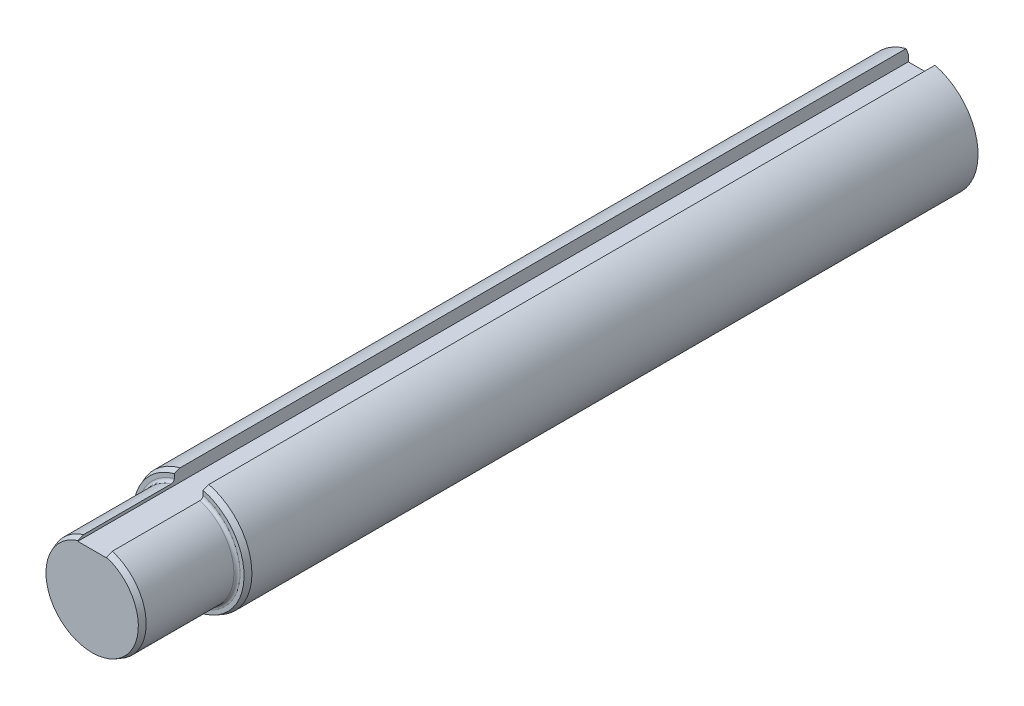
ISO-10303-21;
HEADER;
FILE_DESCRIPTION(('STEP AP214'),'2;1');
FILE_NAME('part.step','',(''),(''),'','','');
FILE_SCHEMA(('AUTOMOTIVE_DESIGN { 1 0 10303 214 1 1 1 1 }'));
ENDSEC;
DATA;
#1=APPLICATION_CONTEXT('core data for automotive mechanical design processes');
#2=APPLICATION_PROTOCOL_DEFINITION('international standard','automotive_design',2000,#1);
#3=PRODUCT_CONTEXT('',#1,'mechanical');
#4=PRODUCT('Part','Part','',(#3));
#5=PRODUCT_RELATED_PRODUCT_CATEGORY('part','',(#4));
#6=PRODUCT_DEFINITION_FORMATION('','',#4);
#7=PRODUCT_DEFINITION_CONTEXT('part definition',#1,'design');
#8=PRODUCT_DEFINITION('design','',#6,#7);
#9=PRODUCT_DEFINITION_SHAPE('','',#8);
#10=(LENGTH_UNIT() NAMED_UNIT(*) SI_UNIT(.MILLI.,.METRE.));
#11=(NAMED_UNIT(*) PLANE_ANGLE_UNIT() SI_UNIT($,.RADIAN.));
#12=(NAMED_UNIT(*) SI_UNIT($,.STERADIAN.) SOLID_ANGLE_UNIT());
#13=UNCERTAINTY_MEASURE_WITH_UNIT(LENGTH_MEASURE(1.E-05),#10,'distance_accuracy_value','');
#14=(GEOMETRIC_REPRESENTATION_CONTEXT(3) GLOBAL_UNCERTAINTY_ASSIGNED_CONTEXT((#13)) GLOBAL_UNIT_ASSIGNED_CONTEXT((#10,
#11,#12)) REPRESENTATION_CONTEXT('',''));
#15=CARTESIAN_POINT('',(0.,0.,0.));
#16=DIRECTION('',(0.,0.,1.));
#17=DIRECTION('',(1.,0.,0.));
#18=AXIS2_PLACEMENT_3D('',#15,#16,#17);
#19=CARTESIAN_POINT('',(-1.1938,0.,-41.075600094));
#20=DIRECTION('',(-1.,0.,0.));
#21=DIRECTION('',(0.,-1.,0.));
#22=AXIS2_PLACEMENT_3D('',#19,#20,#21);
#23=PLANE('',#22);
#24=DIRECTION('',(0.,0.,1.));
#25=VECTOR('',#24,1.);
#26=CARTESIAN_POINT('',(-1.1938,4.61044984898437,-41.075600094));
#27=LINE('',#26,#25);
#28=CARTESIAN_POINT('',(-1.1938,4.61044984898437,-40.9022592699307));
#29=VERTEX_POINT('',#28);
#30=CARTESIAN_POINT('',(-1.1938,4.61044984898437,19.273750126));
#31=VERTEX_POINT('',#30);
#32=EDGE_CURVE('E166',#29,#31,#27,.T.);
#33=ORIENTED_EDGE('',*,*,#32,.T.);
#34=CARTESIAN_POINT('',(-1.1938,4.61044984898437,19.273750126));
#35=CARTESIAN_POINT('',(-1.1938,4.58060288584432,19.353137865186));
#36=CARTESIAN_POINT('',(-1.1938,4.55073900250677,19.4325192347456));
#37=CARTESIAN_POINT('',(-1.1938,4.49097739538637,19.5912692347456));
#38=CARTESIAN_POINT('',(-1.1938,4.46107967160346,19.670637865186));
#39=CARTESIAN_POINT('',(-1.1938,4.431165027623,19.750000126));
#40=B_SPLINE_CURVE_WITH_KNOTS('',3,(#34,#35,#36,#37,#38,#39),.UNSPECIFIED.,.F.,.F.,(4,2,4),(0.,
0.254439148423304,0.508878297275227),.UNSPECIFIED.);
#41=CARTESIAN_POINT('',(-1.1938,4.431165027623,19.750000126));
#42=VERTEX_POINT('',#41);
#43=EDGE_CURVE('E231',#31,#42,#40,.T.);
#44=ORIENTED_EDGE('',*,*,#43,.T.);
#45=DIRECTION('',(0.,1.,0.));
#46=VECTOR('',#45,1.);
#47=CARTESIAN_POINT('',(-1.1938,0.,19.750000126));
#48=LINE('',#47,#46);
#49=CARTESIAN_POINT('',(-1.1938,4.08305737897473,19.750000126));
#50=VERTEX_POINT('',#49);
#51=EDGE_CURVE('E279',#50,#42,#48,.T.);
#52=ORIENTED_EDGE('',*,*,#51,.F.);
#53=CARTESIAN_POINT('',(-1.1938,4.08305737897473,19.750000126));
#54=CARTESIAN_POINT('',(-1.1938,4.06765056022969,19.7499904472236));
#55=CARTESIAN_POINT('',(-1.1938,4.05224482986097,19.7512910544198));
#56=CARTESIAN_POINT('',(-1.1938,4.02185844419262,19.7564376602052));
#57=CARTESIAN_POINT('',(-1.1938,4.00687795240916,19.7602846244751));
#58=CARTESIAN_POINT('',(-1.1938,3.97776585933373,19.7704526468026));
#59=CARTESIAN_POINT('',(-1.1938,3.96363493390597,19.7767756453712));
#60=CARTESIAN_POINT('',(-1.1938,3.93666662762973,19.7917434514951));
#61=CARTESIAN_POINT('',(-1.1938,3.92382864393618,19.8003871700386));
#62=CARTESIAN_POINT('',(-1.1938,3.90007388309732,19.8196084342872));
#63=CARTESIAN_POINT('',(-1.1938,3.88912652462854,19.8301481253765));
#64=CARTESIAN_POINT('',(-1.1938,3.86924776269803,19.8529902805941));
#65=CARTESIAN_POINT('',(-1.1938,3.86031647747126,19.8652928480391));
#66=CARTESIAN_POINT('',(-1.1938,3.84513068592101,19.8907603031013));
#67=CARTESIAN_POINT('',(-1.1938,3.83878042949035,19.9038681718629));
#68=CARTESIAN_POINT('',(-1.1938,3.82848528325712,19.9309891218481));
#69=CARTESIAN_POINT('',(-1.1938,3.82453733268837,19.9450010259489));
#70=CARTESIAN_POINT('',(-1.1938,3.82048086098944,19.9666201718907));
#71=CARTESIAN_POINT('',(-1.1938,3.81943895920923,19.9740632468456));
#72=CARTESIAN_POINT('',(-1.1938,3.8180494369443,19.9890029535984));
#73=CARTESIAN_POINT('',(-1.1938,3.81770080649552,19.9964994914973));
#74=CARTESIAN_POINT('',(-1.1938,3.81770108311266,20.004000126));
#75=B_SPLINE_CURVE_WITH_KNOTS('',3,(#53,#54,#55,#56,#57,#58,#59,#60,#61,#62,#63,#64,#65,#66,#67,
#68,#69,#70,#71,#72,#73,#74),.UNSPECIFIED.,.F.,.F.,(4,2,2,2,2,2,2,2,2,2,4),(0.,
0.0461648311069006,0.0923471798070931,0.138565795087578,0.184762759796601,0.230123136388613,
0.275486172501751,0.318965571666884,0.362389457311054,0.38490804800109,0.407393809297497),.UNSPECIFIED.);
#76=CARTESIAN_POINT('',(-1.1938,3.81770108311271,20.004000126));
#77=VERTEX_POINT('',#76);
#78=EDGE_CURVE('E11',#50,#77,#75,.T.);
#79=ORIENTED_EDGE('',*,*,#78,.T.);
#80=DIRECTION('',(0.,0.,1.));
#81=VECTOR('',#80,1.);
#82=CARTESIAN_POINT('',(-1.1938,3.81770108311271,19.750000126));
#83=LINE('',#82,#81);
#84=CARTESIAN_POINT('',(-1.1938,3.81770108311271,27.273750126));
#85=VERTEX_POINT('',#84);
#86=EDGE_CURVE('E275',#85,#77,#83,.F.);
#87=ORIENTED_EDGE('',*,*,#86,.F.);
#88=CARTESIAN_POINT('',(-1.1938,3.81770108311272,27.273750126));
#89=CARTESIAN_POINT('',(-1.1938,3.78742426532031,27.3531481306492));
#90=CARTESIAN_POINT('',(-1.1938,3.75711735204131,27.4325346328475));
#91=CARTESIAN_POINT('',(-1.1938,3.69644333431697,27.5912846328477));
#92=CARTESIAN_POINT('',(-1.1938,3.66607622987124,27.6706481306494));
#93=CARTESIAN_POINT('',(-1.1938,3.63567902993854,27.750000126));
#94=B_SPLINE_CURVE_WITH_KNOTS('',3,(#88,#89,#90,#91,#92,#93),.UNSPECIFIED.,.F.,.F.,(4,2,4),(0.,
0.254924560437012,0.509849122497376),.UNSPECIFIED.);
#95=CARTESIAN_POINT('',(-1.1938,3.63567902993854,27.750000126));
#96=VERTEX_POINT('',#95);
#97=EDGE_CURVE('E214',#85,#96,#94,.T.);
#98=ORIENTED_EDGE('',*,*,#97,.T.);
#99=DIRECTION('',(0.,-1.,0.));
#100=VECTOR('',#99,1.);
#101=CARTESIAN_POINT('',(-1.1938,0.,27.750000126));
#102=LINE('',#101,#100);
#103=CARTESIAN_POINT('',(-1.1938,3.571875,27.750000126));
#104=VERTEX_POINT('',#103);
#105=EDGE_CURVE('E137',#96,#104,#102,.T.);
#106=ORIENTED_EDGE('',*,*,#105,.T.);
#107=DIRECTION('',(0.,0.,1.));
#108=VECTOR('',#107,1.);
#109=CARTESIAN_POINT('',(-1.1938,3.571875,-41.075600094));
#110=LINE('',#109,#108);
#111=CARTESIAN_POINT('',(-1.1938,3.571875,-41.075600094));
#112=VERTEX_POINT('',#111);
#113=EDGE_CURVE('E148',#112,#104,#110,.T.);
#114=ORIENTED_EDGE('',*,*,#113,.F.);
#115=DIRECTION('',(0.,-1.,0.));
#116=VECTOR('',#115,1.);
#117=CARTESIAN_POINT('',(-1.1938,0.,-41.075600094));
#118=LINE('',#117,#116);
#119=CARTESIAN_POINT('',(-1.1938,4.11664676921643,-41.075600094));
#120=VERTEX_POINT('',#119);
#121=EDGE_CURVE('E155',#120,#112,#118,.T.);
#122=ORIENTED_EDGE('',*,*,#121,.F.);
#123=CARTESIAN_POINT('',(-1.1938,4.11664676921643,-41.075600094));
#124=CARTESIAN_POINT('',(-1.1938,4.19898295992843,-41.0468115870855));
#125=CARTESIAN_POINT('',(-1.1938,4.28130131275715,-41.0179722646649));
#126=CARTESIAN_POINT('',(-1.1938,4.44590233934503,-40.960191989971));
#127=CARTESIAN_POINT('',(-1.1938,4.52818501310562,-40.9312510377019));
#128=CARTESIAN_POINT('',(-1.1938,4.61044984898437,-40.9022592699307));
#129=B_SPLINE_CURVE_WITH_KNOTS('',3,(#123,#124,#125,#126,#127,#128),.UNSPECIFIED.,.F.,.F.,(4,2,
4),(0.,0.26167185475518,0.523343699008511),.UNSPECIFIED.);
#130=EDGE_CURVE('E206',#120,#29,#129,.T.);
#131=ORIENTED_EDGE('',*,*,#130,.T.);
#132=EDGE_LOOP('',(#33,#44,#52,#79,#87,#98,#106,#114,#122,#131));
#133=FACE_BOUND('',#132,.T.);
#134=ADVANCED_FACE('F45',(#133),#23,.F.);
#135=CARTESIAN_POINT('',(1.1938,0.,-41.075600094));
#136=DIRECTION('',(-1.,0.,0.));
#137=DIRECTION('',(0.,0.,1.));
#138=AXIS2_PLACEMENT_3D('',#135,#136,#137);
#139=PLANE('',#138);
#140=DIRECTION('',(0.,0.,1.));
#141=VECTOR('',#140,1.);
#142=CARTESIAN_POINT('',(1.1938,3.81770108311272,19.750000126));
#143=LINE('',#142,#141);
#144=CARTESIAN_POINT('',(1.1938,3.81770108311272,27.273750126));
#145=VERTEX_POINT('',#144);
#146=CARTESIAN_POINT('',(1.1938,3.81770108311272,20.004000126));
#147=VERTEX_POINT('',#146);
#148=EDGE_CURVE('E266',#145,#147,#143,.F.);
#149=ORIENTED_EDGE('',*,*,#148,.T.);
#150=CARTESIAN_POINT('',(1.1938,3.81770108311272,20.004000126));
#151=CARTESIAN_POINT('',(1.1938,3.81768614673787,19.9901709246719));
#152=CARTESIAN_POINT('',(1.1938,3.81888343314373,19.9763494004261));
#153=CARTESIAN_POINT('',(1.1938,3.82358724466687,19.9491336891685));
#154=CARTESIAN_POINT('',(1.1938,3.82708892477228,19.9357386672448));
#155=CARTESIAN_POINT('',(1.1938,3.83628722263969,19.9097266693181));
#156=CARTESIAN_POINT('',(1.1938,3.84198385722178,19.8971096992783));
#157=CARTESIAN_POINT('',(1.1938,3.85537294919485,19.8729835763823));
#158=CARTESIAN_POINT('',(1.1938,3.86306580829021,19.8614746471392));
#159=CARTESIAN_POINT('',(1.1938,3.88037618025025,19.839629991734));
#160=CARTESIAN_POINT('',(1.1938,3.89002927057952,19.8293224965911));
#161=CARTESIAN_POINT('',(1.1938,3.910866274661,19.8103920026525));
#162=CARTESIAN_POINT('',(1.1938,3.92205059035458,19.8017694475952));
#163=CARTESIAN_POINT('',(1.1938,3.94614274225053,19.7860641836489));
#164=CARTESIAN_POINT('',(1.1938,3.95910391776041,19.7790633554804));
#165=CARTESIAN_POINT('',(1.1938,3.98598644095824,19.7672467667704));
#166=CARTESIAN_POINT('',(1.1938,3.99990775093857,19.7624309204738));
#167=CARTESIAN_POINT('',(1.1938,4.02537190226405,19.7558497214918));
#168=CARTESIAN_POINT('',(1.1938,4.03680679490155,19.7536581028517));
#169=CARTESIAN_POINT('',(1.1938,4.05984593294481,19.7507331653191));
#170=CARTESIAN_POINT('',(1.1938,4.07144992968532,19.7499978875281));
#171=CARTESIAN_POINT('',(1.1938,4.08305737897473,19.750000126));
#172=B_SPLINE_CURVE_WITH_KNOTS('',3,(#150,#151,#152,#153,#154,#155,#156,#157,#158,#159,#160,
#161,#162,#163,#164,#165,#166,#167,#168,#169,#170,#171),.UNSPECIFIED.,.F.,.F.,(4,2,2,2,2,2,2,2,
2,2,4),(0.,0.0414241119424207,0.0827614063279176,0.124099017490222,0.165444953565082,
0.207621940800539,0.249810020652985,0.293807086001235,0.337802424424029,0.372641853649469,
0.407434389063359),.UNSPECIFIED.);
#173=CARTESIAN_POINT('',(1.1938,4.08305737897473,19.750000126));
#174=VERTEX_POINT('',#173);
#175=EDGE_CURVE('E60',#147,#174,#172,.T.);
#176=ORIENTED_EDGE('',*,*,#175,.T.);
#177=DIRECTION('',(0.,1.,0.));
#178=VECTOR('',#177,1.);
#179=CARTESIAN_POINT('',(1.1938,0.,19.750000126));
#180=LINE('',#179,#178);
#181=CARTESIAN_POINT('',(1.1938,4.431165027623,19.750000126));
#182=VERTEX_POINT('',#181);
#183=EDGE_CURVE('E281',#174,#182,#180,.T.);
#184=ORIENTED_EDGE('',*,*,#183,.T.);
#185=CARTESIAN_POINT('',(1.1938,4.431165027623,19.750000126));
#186=CARTESIAN_POINT('',(1.1938,4.46107967160346,19.670637865186));
#187=CARTESIAN_POINT('',(1.1938,4.49097739538637,19.5912692347456));
#188=CARTESIAN_POINT('',(1.1938,4.55073900250677,19.4325192347456));
#189=CARTESIAN_POINT('',(1.1938,4.58060288584432,19.353137865186));
#190=CARTESIAN_POINT('',(1.1938,4.61044984898437,19.273750126));
#191=B_SPLINE_CURVE_WITH_KNOTS('',3,(#185,#186,#187,#188,#189,#190),.UNSPECIFIED.,.F.,.F.,(4,2,
4),(0.,0.254439148851926,0.508878297275234),.UNSPECIFIED.);
#192=CARTESIAN_POINT('',(1.1938,4.61044984898437,19.273750126));
#193=VERTEX_POINT('',#192);
#194=EDGE_CURVE('E263',#182,#193,#191,.T.);
#195=ORIENTED_EDGE('',*,*,#194,.T.);
#196=DIRECTION('',(0.,0.,1.));
#197=VECTOR('',#196,1.);
#198=CARTESIAN_POINT('',(1.1938,4.61044984898437,-41.075600094));
#199=LINE('',#198,#197);
#200=CARTESIAN_POINT('',(1.1938,4.61044984898437,-40.9022592699307));
#201=VERTEX_POINT('',#200);
#202=EDGE_CURVE('E149',#201,#193,#199,.T.);
#203=ORIENTED_EDGE('',*,*,#202,.F.);
#204=CARTESIAN_POINT('',(1.1938,4.61044984898437,-40.9022592699307));
#205=CARTESIAN_POINT('',(1.1938,4.52818501310562,-40.9312510377019));
#206=CARTESIAN_POINT('',(1.1938,4.44590233934503,-40.960191989971));
#207=CARTESIAN_POINT('',(1.1938,4.28130131275715,-41.0179722646649));
#208=CARTESIAN_POINT('',(1.1938,4.19898295992843,-41.0468115870855));
#209=CARTESIAN_POINT('',(1.1938,4.11664676921643,-41.075600094));
#210=B_SPLINE_CURVE_WITH_KNOTS('',3,(#204,#205,#206,#207,#208,#209),.UNSPECIFIED.,.F.,.F.,(4,2,
4),(0.,0.261671844253333,0.523343699008512),.UNSPECIFIED.);
#211=CARTESIAN_POINT('',(1.1938,4.11664676921643,-41.075600094));
#212=VERTEX_POINT('',#211);
#213=EDGE_CURVE('E179',#201,#212,#210,.T.);
#214=ORIENTED_EDGE('',*,*,#213,.T.);
#215=DIRECTION('',(0.,-1.,0.));
#216=VECTOR('',#215,1.);
#217=CARTESIAN_POINT('',(1.1938,0.,-41.075600094));
#218=LINE('',#217,#216);
#219=CARTESIAN_POINT('',(1.1938,3.571875,-41.075600094));
#220=VERTEX_POINT('',#219);
#221=EDGE_CURVE('E143',#212,#220,#218,.T.);
#222=ORIENTED_EDGE('',*,*,#221,.T.);
#223=DIRECTION('',(0.,0.,1.));
#224=VECTOR('',#223,1.);
#225=CARTESIAN_POINT('',(1.1938,3.571875,-41.075600094));
#226=LINE('',#225,#224);
#227=CARTESIAN_POINT('',(1.1938,3.571875,27.750000126));
#228=VERTEX_POINT('',#227);
#229=EDGE_CURVE('E140',#220,#228,#226,.T.);
#230=ORIENTED_EDGE('',*,*,#229,.T.);
#231=DIRECTION('',(0.,-1.,0.));
#232=VECTOR('',#231,1.);
#233=CARTESIAN_POINT('',(1.1938,0.,27.750000126));
#234=LINE('',#233,#232);
#235=CARTESIAN_POINT('',(1.1938,3.63567902993854,27.750000126));
#236=VERTEX_POINT('',#235);
#237=EDGE_CURVE('E128',#236,#228,#234,.T.);
#238=ORIENTED_EDGE('',*,*,#237,.F.);
#239=CARTESIAN_POINT('',(1.1938,3.63567902993854,27.750000126));
#240=CARTESIAN_POINT('',(1.1938,3.66607622987124,27.6706481306494));
#241=CARTESIAN_POINT('',(1.1938,3.69644333431697,27.5912846328477));
#242=CARTESIAN_POINT('',(1.1938,3.75711735204131,27.4325346328475));
#243=CARTESIAN_POINT('',(1.1938,3.78742426532031,27.3531481306492));
#244=CARTESIAN_POINT('',(1.1938,3.81770108311271,27.273750126));
#245=B_SPLINE_CURVE_WITH_KNOTS('',3,(#239,#240,#241,#242,#243,#244),.UNSPECIFIED.,.F.,.F.,(4,2,
4),(0.,0.254924562060364,0.509849122497375),.UNSPECIFIED.);
#246=EDGE_CURVE('E187',#236,#145,#245,.T.);
#247=ORIENTED_EDGE('',*,*,#246,.T.);
#248=EDGE_LOOP('',(#149,#176,#184,#195,#203,#214,#222,#230,#238,#247));
#249=FACE_BOUND('',#248,.T.);
#250=ADVANCED_FACE('F141',(#249),#139,.T.);
#251=CARTESIAN_POINT('',(0.,0.,-41.075600094));
#252=DIRECTION('',(0.,0.,1.));
#253=DIRECTION('',(1.,0.,0.));
#254=AXIS2_PLACEMENT_3D('',#251,#252,#253);
#255=CYLINDRICAL_SURFACE('',#254,4.7625);
#256=ORIENTED_EDGE('',*,*,#202,.T.);
#257=CARTESIAN_POINT('',(0.,0.,19.273750126));
#258=DIRECTION('',(0.,0.,1.));
#259=DIRECTION('',(1.,0.,0.));
#260=AXIS2_PLACEMENT_3D('',#257,#258,#259);
#261=CIRCLE('',#260,4.7625);
#262=EDGE_CURVE('E215',#193,#31,#261,.F.);
#263=ORIENTED_EDGE('',*,*,#262,.T.);
#264=ORIENTED_EDGE('',*,*,#32,.F.);
#265=CARTESIAN_POINT('',(0.,0.,-40.9022592699307));
#266=DIRECTION('',(0.,0.,1.));
#267=DIRECTION('',(1.,0.,0.));
#268=AXIS2_PLACEMENT_3D('',#265,#266,#267);
#269=CIRCLE('',#268,4.7625);
#270=EDGE_CURVE('E260',#29,#201,#269,.T.);
#271=ORIENTED_EDGE('',*,*,#270,.T.);
#272=EDGE_LOOP('',(#256,#263,#264,#271));
#273=FACE_BOUND('',#272,.T.);
#274=ADVANCED_FACE('F225',(#273),#255,.T.);
#275=CARTESIAN_POINT('',(0.,0.,27.750000126));
#276=DIRECTION('',(0.,0.,1.));
#277=DIRECTION('',(1.,0.,0.));
#278=AXIS2_PLACEMENT_3D('',#275,#276,#277);
#279=PLANE('',#278);
#280=ORIENTED_EDGE('',*,*,#105,.F.);
#281=CARTESIAN_POINT('',(0.,0.,27.750000126));
#282=DIRECTION('',(0.,0.,1.));
#283=DIRECTION('',(1.,0.,0.));
#284=AXIS2_PLACEMENT_3D('',#281,#282,#283);
#285=CIRCLE('',#284,3.82665917593072);
#286=EDGE_CURVE('E135',#96,#236,#285,.T.);
#287=ORIENTED_EDGE('',*,*,#286,.T.);
#288=ORIENTED_EDGE('',*,*,#237,.T.);
#289=DIRECTION('',(1.,0.,0.));
#290=VECTOR('',#289,1.);
#291=CARTESIAN_POINT('',(0.,3.571875,27.750000126));
#292=LINE('',#291,#290);
#293=EDGE_CURVE('E133',#104,#228,#292,.T.);
#294=ORIENTED_EDGE('',*,*,#293,.F.);
#295=EDGE_LOOP('',(#280,#287,#288,#294));
#296=FACE_BOUND('',#295,.T.);
#297=ADVANCED_FACE('F131',(#296),#279,.T.);
#298=CARTESIAN_POINT('',(0.,3.571875,-41.075600094));
#299=DIRECTION('',(0.,-1.,0.));
#300=DIRECTION('',(0.,0.,-1.));
#301=AXIS2_PLACEMENT_3D('',#298,#299,#300);
#302=PLANE('',#301);
#303=ORIENTED_EDGE('',*,*,#113,.T.);
#304=ORIENTED_EDGE('',*,*,#293,.T.);
#305=ORIENTED_EDGE('',*,*,#229,.F.);
#306=DIRECTION('',(1.,0.,0.));
#307=VECTOR('',#306,1.);
#308=CARTESIAN_POINT('',(0.,3.571875,-41.075600094));
#309=LINE('',#308,#307);
#310=EDGE_CURVE('E163',#112,#220,#309,.T.);
#311=ORIENTED_EDGE('',*,*,#310,.F.);
#312=EDGE_LOOP('',(#303,#304,#305,#311));
#313=FACE_BOUND('',#312,.T.);
#314=ADVANCED_FACE('F152',(#313),#302,.F.);
#315=CARTESIAN_POINT('',(0.,0.,-41.075600094));
#316=DIRECTION('',(0.,0.,1.));
#317=DIRECTION('',(1.,0.,0.));
#318=AXIS2_PLACEMENT_3D('',#315,#316,#317);
#319=PLANE('',#318);
#320=ORIENTED_EDGE('',*,*,#221,.F.);
#321=CARTESIAN_POINT('',(0.,0.,-41.075600094));
#322=DIRECTION('',(0.,0.,1.));
#323=DIRECTION('',(1.,0.,0.));
#324=AXIS2_PLACEMENT_3D('',#321,#322,#323);
#325=CIRCLE('',#324,4.28625000000001);
#326=EDGE_CURVE('E244',#212,#120,#325,.F.);
#327=ORIENTED_EDGE('',*,*,#326,.T.);
#328=ORIENTED_EDGE('',*,*,#121,.T.);
#329=ORIENTED_EDGE('',*,*,#310,.T.);
#330=EDGE_LOOP('',(#320,#327,#328,#329));
#331=FACE_BOUND('',#330,.T.);
#332=ADVANCED_FACE('F302',(#331),#319,.F.);
#333=CARTESIAN_POINT('',(0.,0.,19.750000126));
#334=DIRECTION('',(0.,0.,1.));
#335=DIRECTION('',(1.,0.,0.));
#336=AXIS2_PLACEMENT_3D('',#333,#334,#335);
#337=PLANE('',#336);
#338=ORIENTED_EDGE('',*,*,#183,.F.);
#339=CARTESIAN_POINT('',(0.,0.,19.750000126));
#340=DIRECTION('',(0.,0.,1.));
#341=DIRECTION('',(1.,0.,0.));
#342=AXIS2_PLACEMENT_3D('',#339,#340,#341);
#343=CIRCLE('',#342,4.254);
#344=EDGE_CURVE('E73',#174,#50,#343,.F.);
#345=ORIENTED_EDGE('',*,*,#344,.T.);
#346=ORIENTED_EDGE('',*,*,#51,.T.);
#347=CARTESIAN_POINT('',(0.,0.,19.750000126));
#348=DIRECTION('',(0.,0.,1.));
#349=DIRECTION('',(1.,0.,0.));
#350=AXIS2_PLACEMENT_3D('',#347,#348,#349);
#351=CIRCLE('',#350,4.58915917593072);
#352=EDGE_CURVE('E168',#42,#182,#351,.T.);
#353=ORIENTED_EDGE('',*,*,#352,.T.);
#354=EDGE_LOOP('',(#338,#345,#346,#353));
#355=FACE_BOUND('',#354,.T.);
#356=ADVANCED_FACE('F291',(#355),#337,.T.);
#357=CARTESIAN_POINT('',(0.,0.,19.750000126));
#358=DIRECTION('',(0.,0.,1.));
#359=DIRECTION('',(1.,0.,0.));
#360=AXIS2_PLACEMENT_3D('',#357,#358,#359);
#361=CYLINDRICAL_SURFACE('',#360,4.);
#362=ORIENTED_EDGE('',*,*,#86,.T.);
#363=CARTESIAN_POINT('',(0.,0.,20.004000126));
#364=DIRECTION('',(0.,0.,1.));
#365=DIRECTION('',(1.,0.,0.));
#366=AXIS2_PLACEMENT_3D('',#363,#364,#365);
#367=CIRCLE('',#366,4.);
#368=EDGE_CURVE('E247',#77,#147,#367,.T.);
#369=ORIENTED_EDGE('',*,*,#368,.T.);
#370=ORIENTED_EDGE('',*,*,#148,.F.);
#371=CARTESIAN_POINT('',(0.,0.,27.273750126));
#372=DIRECTION('',(0.,0.,1.));
#373=DIRECTION('',(1.,0.,0.));
#374=AXIS2_PLACEMENT_3D('',#371,#372,#373);
#375=CIRCLE('',#374,4.);
#376=EDGE_CURVE('E241',#145,#85,#375,.F.);
#377=ORIENTED_EDGE('',*,*,#376,.T.);
#378=EDGE_LOOP('',(#362,#369,#370,#377));
#379=FACE_BOUND('',#378,.T.);
#380=ADVANCED_FACE('F271',(#379),#361,.T.);
#381=CARTESIAN_POINT('',(0.,0.,19.750000126));
#382=DIRECTION('',(0.,0.,-1.));
#383=DIRECTION('',(-1.,0.,0.));
#384=AXIS2_PLACEMENT_3D('',#381,#382,#383);
#385=CONICAL_SURFACE('',#384,4.58915917593072,0.34906585039886);
#386=ORIENTED_EDGE('',*,*,#43,.F.);
#387=ORIENTED_EDGE('',*,*,#262,.F.);
#388=ORIENTED_EDGE('',*,*,#194,.F.);
#389=ORIENTED_EDGE('',*,*,#352,.F.);
#390=EDGE_LOOP('',(#386,#387,#388,#389));
#391=FACE_BOUND('',#390,.T.);
#392=ADVANCED_FACE('F226',(#391),#385,.T.);
#393=CARTESIAN_POINT('',(0.,0.,27.750000126));
#394=DIRECTION('',(0.,0.,-1.));
#395=DIRECTION('',(-1.,0.,0.));
#396=AXIS2_PLACEMENT_3D('',#393,#394,#395);
#397=CONICAL_SURFACE('',#396,3.82665917593072,0.349065850398866);
#398=ORIENTED_EDGE('',*,*,#97,.F.);
#399=ORIENTED_EDGE('',*,*,#376,.F.);
#400=ORIENTED_EDGE('',*,*,#246,.F.);
#401=ORIENTED_EDGE('',*,*,#286,.F.);
#402=EDGE_LOOP('',(#398,#399,#400,#401));
#403=FACE_BOUND('',#402,.T.);
#404=ADVANCED_FACE('F200',(#403),#397,.T.);
#405=CARTESIAN_POINT('',(0.,0.,-40.9022592699307));
#406=DIRECTION('',(0.,0.,1.));
#407=DIRECTION('',(1.,0.,0.));
#408=AXIS2_PLACEMENT_3D('',#405,#406,#407);
#409=CONICAL_SURFACE('',#408,4.7625,1.22173047639604);
#410=ORIENTED_EDGE('',*,*,#130,.F.);
#411=ORIENTED_EDGE('',*,*,#326,.F.);
#412=ORIENTED_EDGE('',*,*,#213,.F.);
#413=ORIENTED_EDGE('',*,*,#270,.F.);
#414=EDGE_LOOP('',(#410,#411,#412,#413));
#415=FACE_BOUND('',#414,.T.);
#416=ADVANCED_FACE('F197',(#415),#409,.T.);
#417=CARTESIAN_POINT('',(0.,0.,20.004000126));
#418=DIRECTION('',(0.,0.,1.));
#419=DIRECTION('',(1.,0.,0.));
#420=AXIS2_PLACEMENT_3D('',#417,#418,#419);
#421=TOROIDAL_SURFACE('',#420,4.254,0.254);
#422=ORIENTED_EDGE('',*,*,#78,.F.);
#423=ORIENTED_EDGE('',*,*,#344,.F.);
#424=ORIENTED_EDGE('',*,*,#175,.F.);
#425=ORIENTED_EDGE('',*,*,#368,.F.);
#426=EDGE_LOOP('',(#422,#423,#424,#425));
#427=FACE_BOUND('',#426,.T.);
#428=ADVANCED_FACE('F47',(#427),#421,.F.);
#429=CLOSED_SHELL('',(#134,#250,#274,#297,#314,#332,#356,#380,#392,#404,#416,#428));
#430=MANIFOLD_SOLID_BREP('B2',#429);
#431=ADVANCED_BREP_SHAPE_REPRESENTATION('',(#18,#430),#14);
#432=SHAPE_DEFINITION_REPRESENTATION(#9,#431);
ENDSEC;
END-ISO-10303-21;
